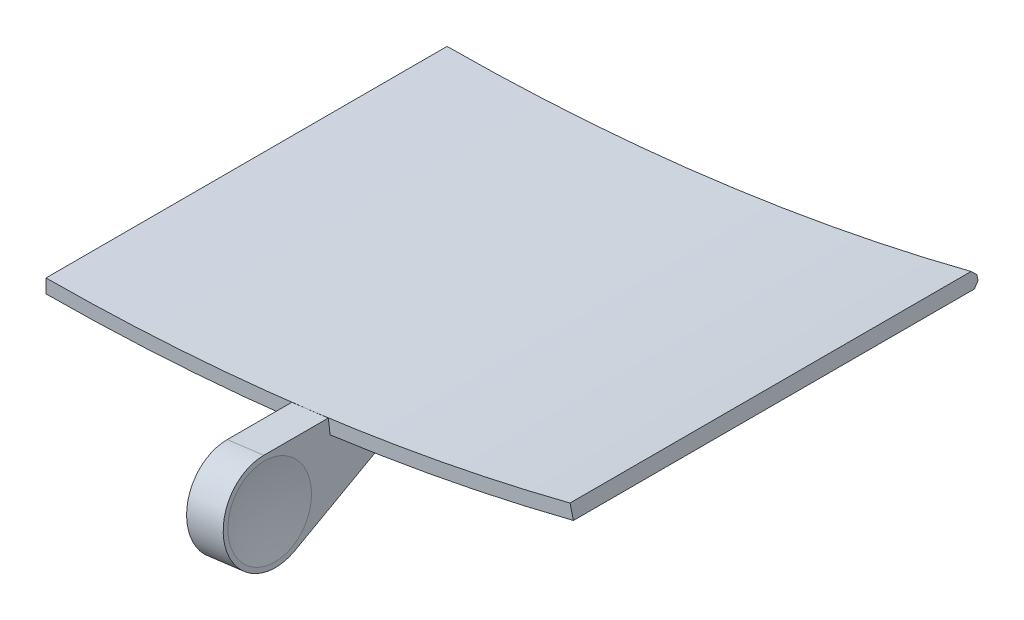
ISO-10303-21;
HEADER;
FILE_DESCRIPTION(('STEP AP214'),'2;1');
FILE_NAME('part.step','',(''),(''),'','','');
FILE_SCHEMA(('AUTOMOTIVE_DESIGN { 1 0 10303 214 1 1 1 1 }'));
ENDSEC;
DATA;
#1=APPLICATION_CONTEXT('core data for automotive mechanical design processes');
#2=APPLICATION_PROTOCOL_DEFINITION('international standard','automotive_design',2000,#1);
#3=PRODUCT_CONTEXT('',#1,'mechanical');
#4=PRODUCT('Part','Part','',(#3));
#5=PRODUCT_RELATED_PRODUCT_CATEGORY('part','',(#4));
#6=PRODUCT_DEFINITION_FORMATION('','',#4);
#7=PRODUCT_DEFINITION_CONTEXT('part definition',#1,'design');
#8=PRODUCT_DEFINITION('design','',#6,#7);
#9=PRODUCT_DEFINITION_SHAPE('','',#8);
#10=(LENGTH_UNIT() NAMED_UNIT(*) SI_UNIT(.MILLI.,.METRE.));
#11=(NAMED_UNIT(*) PLANE_ANGLE_UNIT() SI_UNIT($,.RADIAN.));
#12=(NAMED_UNIT(*) SI_UNIT($,.STERADIAN.) SOLID_ANGLE_UNIT());
#13=UNCERTAINTY_MEASURE_WITH_UNIT(LENGTH_MEASURE(1.E-05),#10,'distance_accuracy_value','');
#14=(GEOMETRIC_REPRESENTATION_CONTEXT(3) GLOBAL_UNCERTAINTY_ASSIGNED_CONTEXT((#13)) GLOBAL_UNIT_ASSIGNED_CONTEXT((#10,
#11,#12)) REPRESENTATION_CONTEXT('',''));
#15=CARTESIAN_POINT('',(0.,0.,0.));
#16=DIRECTION('',(0.,0.,1.));
#17=DIRECTION('',(1.,0.,0.));
#18=AXIS2_PLACEMENT_3D('',#15,#16,#17);
#19=CARTESIAN_POINT('',(0.,0.,44.));
#20=DIRECTION('',(0.,0.,-1.));
#21=DIRECTION('',(-1.,0.,0.));
#22=AXIS2_PLACEMENT_3D('',#19,#20,#21);
#23=CYLINDRICAL_SURFACE('',#22,236.500000000393);
#24=DIRECTION('',(0.,0.,-1.));
#25=VECTOR('',#24,1.);
#26=CARTESIAN_POINT('',(32.013045813414,-234.323312749573,44.));
#27=LINE('',#26,#25);
#28=CARTESIAN_POINT('',(32.013045813414,-234.323312749573,31.687942508641));
#29=VERTEX_POINT('',#28);
#30=CARTESIAN_POINT('',(32.013045813414,-234.323312749573,44.));
#31=VERTEX_POINT('',#30);
#32=EDGE_CURVE('E64',#29,#31,#27,.F.);
#33=ORIENTED_EDGE('',*,*,#32,.F.);
#34=CARTESIAN_POINT('',(0.,0.,-474.208939921087));
#35=DIRECTION('',(0.11502993686361,-0.898571297000495,-0.423482866043011));
#36=DIRECTION('',(-0.0537730281143868,0.42005499554155,-0.905904113120146));
#37=AXIS2_PLACEMENT_3D('',#34,#35,#36);
#38=ELLIPSE('',#37,558.464152777254,236.500000000393);
#39=CARTESIAN_POINT('',(28.0454237042457,-234.831224945567,31.687942508641));
#40=VERTEX_POINT('',#39);
#41=EDGE_CURVE('E11',#29,#40,#38,.T.);
#42=ORIENTED_EDGE('',*,*,#41,.T.);
#43=DIRECTION('',(0.,0.,-1.));
#44=VECTOR('',#43,1.);
#45=CARTESIAN_POINT('',(28.0454237042457,-234.831224945567,44.));
#46=LINE('',#45,#44);
#47=CARTESIAN_POINT('',(28.0454237042457,-234.831224945567,44.));
#48=VERTEX_POINT('',#47);
#49=EDGE_CURVE('E181',#40,#48,#46,.F.);
#50=ORIENTED_EDGE('',*,*,#49,.T.);
#51=CARTESIAN_POINT('',(0.,0.,44.));
#52=DIRECTION('',(0.,0.,1.));
#53=DIRECTION('',(1.,0.,0.));
#54=AXIS2_PLACEMENT_3D('',#51,#52,#53);
#55=CIRCLE('',#54,236.500000000393);
#56=CARTESIAN_POINT('',(1.2,-236.49695558363,44.));
#57=VERTEX_POINT('',#56);
#58=EDGE_CURVE('E303',#57,#48,#55,.T.);
#59=ORIENTED_EDGE('',*,*,#58,.F.);
#60=DIRECTION('',(0.,0.,1.));
#61=VECTOR('',#60,1.);
#62=CARTESIAN_POINT('',(1.2,-236.49695558363,0.));
#63=LINE('',#62,#61);
#64=CARTESIAN_POINT('',(1.2,-236.49695558363,0.500000000245665));
#65=VERTEX_POINT('',#64);
#66=EDGE_CURVE('E197',#65,#57,#63,.T.);
#67=ORIENTED_EDGE('',*,*,#66,.F.);
#68=CARTESIAN_POINT('',(0.,0.,0.499999999999973));
#69=DIRECTION('',(0.,0.,1.));
#70=DIRECTION('',(1.,0.,0.));
#71=AXIS2_PLACEMENT_3D('',#68,#69,#70);
#72=CIRCLE('',#71,236.500000000393);
#73=CARTESIAN_POINT('',(58.4123874795451,-229.172954314259,0.499999999999973));
#74=VERTEX_POINT('',#73);
#75=EDGE_CURVE('E297',#65,#74,#72,.T.);
#76=ORIENTED_EDGE('',*,*,#75,.T.);
#77=DIRECTION('',(0.,0.,1.));
#78=VECTOR('',#77,1.);
#79=CARTESIAN_POINT('',(58.4123874796194,-229.172954314544,0.));
#80=LINE('',#79,#78);
#81=CARTESIAN_POINT('',(58.4123874796194,-229.172954314544,44.));
#82=VERTEX_POINT('',#81);
#83=EDGE_CURVE('E192',#74,#82,#80,.T.);
#84=ORIENTED_EDGE('',*,*,#83,.T.);
#85=EDGE_CURVE('E307',#31,#82,#55,.T.);
#86=ORIENTED_EDGE('',*,*,#85,.F.);
#87=EDGE_LOOP('',(#33,#42,#50,#59,#67,#76,#84,#86));
#88=FACE_BOUND('',#87,.T.);
#89=ADVANCED_FACE('F47',(#88),#23,.T.);
#90=CARTESIAN_POINT('',(0.,0.,44.));
#91=DIRECTION('',(0.,0.,1.));
#92=DIRECTION('',(1.,0.,0.));
#93=AXIS2_PLACEMENT_3D('',#90,#91,#92);
#94=PLANE('',#93);
#95=DIRECTION('',(-0.991905527292072,-0.126978048998387,0.));
#96=VECTOR('',#95,1.);
#97=CARTESIAN_POINT('',(31.8236525692553,-232.843842816033,44.));
#98=LINE('',#97,#96);
#99=CARTESIAN_POINT('',(31.8236525692553,-232.843842816033,44.));
#100=VERTEX_POINT('',#99);
#101=CARTESIAN_POINT('',(29.8398415146712,-233.097798914029,44.));
#102=VERTEX_POINT('',#101);
#103=EDGE_CURVE('E177',#100,#102,#98,.T.);
#104=ORIENTED_EDGE('',*,*,#103,.F.);
#105=DIRECTION('',(0.126978048998387,-0.991905527292072,0.));
#106=VECTOR('',#105,1.);
#107=CARTESIAN_POINT('',(1.98381105458415,0.253956097996774,44.));
#108=LINE('',#107,#106);
#109=EDGE_CURVE('E58',#100,#31,#108,.T.);
#110=ORIENTED_EDGE('',*,*,#109,.T.);
#111=ORIENTED_EDGE('',*,*,#85,.T.);
#112=DIRECTION('',(0.251900457292544,-0.967753150145122,0.));
#113=VECTOR('',#112,1.);
#114=CARTESIAN_POINT('',(58.0345318984014,-227.721305782605,44.));
#115=LINE('',#114,#113);
#116=CARTESIAN_POINT('',(58.0345318984014,-227.721305782605,44.));
#117=VERTEX_POINT('',#116);
#118=EDGE_CURVE('E202',#117,#82,#115,.T.);
#119=ORIENTED_EDGE('',*,*,#118,.F.);
#120=CARTESIAN_POINT('',(0.,0.,44.));
#121=DIRECTION('',(0.,0.,-1.));
#122=DIRECTION('',(1.,0.,0.));
#123=AXIS2_PLACEMENT_3D('',#120,#121,#122);
#124=CIRCLE('',#123,235.000000000396);
#125=EDGE_CURVE('E308',#117,#102,#124,.T.);
#126=ORIENTED_EDGE('',*,*,#125,.T.);
#127=EDGE_LOOP('',(#104,#110,#111,#119,#126));
#128=FACE_BOUND('',#127,.T.);
#129=ADVANCED_FACE('F277',(#128),#94,.T.);
#130=CARTESIAN_POINT('',(0.,0.,44.));
#131=DIRECTION('',(0.,0.,-1.));
#132=DIRECTION('',(-1.,0.,0.));
#133=AXIS2_PLACEMENT_3D('',#130,#131,#132);
#134=CYLINDRICAL_SURFACE('',#133,235.000000000396);
#135=CARTESIAN_POINT('',(0.,0.,0.499999999999973));
#136=DIRECTION('',(0.,0.,1.));
#137=DIRECTION('',(1.,0.,0.));
#138=AXIS2_PLACEMENT_3D('',#135,#136,#137);
#139=CIRCLE('',#138,235.000000000396);
#140=CARTESIAN_POINT('',(58.0345318984014,-227.721305782605,0.500000000393128));
#141=VERTEX_POINT('',#140);
#142=CARTESIAN_POINT('',(1.2,-234.996936150243,0.500000000393142));
#143=VERTEX_POINT('',#142);
#144=EDGE_CURVE('E259',#141,#143,#139,.F.);
#145=ORIENTED_EDGE('',*,*,#144,.T.);
#146=DIRECTION('',(0.,0.,1.));
#147=VECTOR('',#146,1.);
#148=CARTESIAN_POINT('',(1.2,-234.996936150243,0.));
#149=LINE('',#148,#147);
#150=CARTESIAN_POINT('',(1.2,-234.996936150243,44.));
#151=VERTEX_POINT('',#150);
#152=EDGE_CURVE('E203',#143,#151,#149,.T.);
#153=ORIENTED_EDGE('',*,*,#152,.T.);
#154=EDGE_CURVE('E311',#102,#151,#124,.T.);
#155=ORIENTED_EDGE('',*,*,#154,.F.);
#156=ORIENTED_EDGE('',*,*,#125,.F.);
#157=DIRECTION('',(0.,0.,1.));
#158=VECTOR('',#157,1.);
#159=CARTESIAN_POINT('',(58.0345318984014,-227.721305782605,0.));
#160=LINE('',#159,#158);
#161=EDGE_CURVE('E210',#141,#117,#160,.T.);
#162=ORIENTED_EDGE('',*,*,#161,.F.);
#163=EDGE_LOOP('',(#145,#153,#155,#156,#162));
#164=FACE_BOUND('',#163,.T.);
#165=ADVANCED_FACE('F273',(#164),#134,.F.);
#166=DIRECTION('',(-0.991905527292072,-0.126978048998387,0.));
#167=VECTOR('',#166,1.);
#168=CARTESIAN_POINT('',(29.8398415146712,-233.097798914029,44.));
#169=LINE('',#168,#167);
#170=CARTESIAN_POINT('',(27.8560304600871,-233.351755012026,44.));
#171=VERTEX_POINT('',#170);
#172=EDGE_CURVE('E333',#102,#171,#169,.T.);
#173=ORIENTED_EDGE('',*,*,#172,.F.);
#174=ORIENTED_EDGE('',*,*,#154,.T.);
#175=DIRECTION('',(0.,1.,0.));
#176=VECTOR('',#175,1.);
#177=CARTESIAN_POINT('',(1.2,-234.996936150243,44.));
#178=LINE('',#177,#176);
#179=EDGE_CURVE('E198',#57,#151,#178,.T.);
#180=ORIENTED_EDGE('',*,*,#179,.F.);
#181=ORIENTED_EDGE('',*,*,#58,.T.);
#182=DIRECTION('',(0.126978048998387,-0.991905527292072,0.));
#183=VECTOR('',#182,1.);
#184=CARTESIAN_POINT('',(-1.98381105458415,-0.253956097996774,44.));
#185=LINE('',#184,#183);
#186=EDGE_CURVE('E330',#171,#48,#185,.T.);
#187=ORIENTED_EDGE('',*,*,#186,.F.);
#188=EDGE_LOOP('',(#173,#174,#180,#181,#187));
#189=FACE_BOUND('',#188,.T.);
#190=ADVANCED_FACE('F246',(#189),#94,.T.);
#191=CARTESIAN_POINT('',(0.,0.,0.));
#192=DIRECTION('',(0.,0.,1.));
#193=DIRECTION('',(1.,0.,0.));
#194=AXIS2_PLACEMENT_3D('',#191,#192,#193);
#195=PLANE('',#194);
#196=CARTESIAN_POINT('',(0.,0.,0.));
#197=DIRECTION('',(0.,0.,1.));
#198=DIRECTION('',(1.,0.,0.));
#199=AXIS2_PLACEMENT_3D('',#196,#197,#198);
#200=CIRCLE('',#199,236.000000000393);
#201=CARTESIAN_POINT('',(58.2864356261108,-228.689071497063,0.));
#202=VERTEX_POINT('',#201);
#203=CARTESIAN_POINT('',(1.2,-235.996949133216,0.));
#204=VERTEX_POINT('',#203);
#205=EDGE_CURVE('E291',#202,#204,#200,.F.);
#206=ORIENTED_EDGE('',*,*,#205,.T.);
#207=DIRECTION('',(0.,1.,0.));
#208=VECTOR('',#207,1.);
#209=CARTESIAN_POINT('',(1.2,-234.996936150243,0.));
#210=LINE('',#209,#208);
#211=CARTESIAN_POINT('',(1.2,-235.496942655709,0.));
#212=VERTEX_POINT('',#211);
#213=EDGE_CURVE('E193',#204,#212,#210,.T.);
#214=ORIENTED_EDGE('',*,*,#213,.T.);
#215=CARTESIAN_POINT('',(0.,0.,0.));
#216=DIRECTION('',(0.,0.,1.));
#217=DIRECTION('',(1.,0.,0.));
#218=AXIS2_PLACEMENT_3D('',#215,#216,#217);
#219=CIRCLE('',#218,235.500000000396);
#220=CARTESIAN_POINT('',(58.1604837657777,-228.205188653363,0.));
#221=VERTEX_POINT('',#220);
#222=EDGE_CURVE('E298',#212,#221,#219,.T.);
#223=ORIENTED_EDGE('',*,*,#222,.T.);
#224=DIRECTION('',(0.251900457292544,-0.967753150145122,0.));
#225=VECTOR('',#224,1.);
#226=CARTESIAN_POINT('',(58.0345318984014,-227.721305782605,0.));
#227=LINE('',#226,#225);
#228=EDGE_CURVE('E213',#221,#202,#227,.T.);
#229=ORIENTED_EDGE('',*,*,#228,.T.);
#230=EDGE_LOOP('',(#206,#214,#223,#229));
#231=FACE_BOUND('',#230,.T.);
#232=ADVANCED_FACE('F280',(#231),#195,.F.);
#233=CARTESIAN_POINT('',(0.,0.,0.499999999999973));
#234=DIRECTION('',(0.,0.,-1.));
#235=DIRECTION('',(-1.,0.,0.));
#236=AXIS2_PLACEMENT_3D('',#233,#234,#235);
#237=CONICAL_SURFACE('',#236,235.000000000396,0.785398163397504);
#238=CARTESIAN_POINT('',(1.2,-234.287826686805,1.20910019072185));
#239=CARTESIAN_POINT('',(1.2,-234.607530926746,0.88940014410588));
#240=CARTESIAN_POINT('',(1.2,-234.927235158208,0.56970008901092));
#241=CARTESIAN_POINT('',(1.2,-235.566643604175,-0.0697000381369862));
#242=CARTESIAN_POINT('',(1.2,-235.886347818679,-0.389400110189931));
#243=CARTESIAN_POINT('',(1.2,-236.206052024705,-0.709100190721872));
#244=B_SPLINE_CURVE_WITH_KNOTS('',3,(#238,#239,#240,#241,#242,#243),.UNSPECIFIED.,.F.,.F.,(4,2,
4),(0.,1.35638132086163,2.71276264172324),.UNSPECIFIED.);
#245=EDGE_CURVE('E230',#143,#212,#244,.T.);
#246=ORIENTED_EDGE('',*,*,#245,.F.);
#247=ORIENTED_EDGE('',*,*,#144,.F.);
#248=CARTESIAN_POINT('',(58.1605341465232,-228.205382206506,-0.000200000000002847));
#249=CARTESIAN_POINT('',(58.1395250956562,-228.124669470306,0.0832011114824541));
#250=CARTESIAN_POINT('',(58.1185160446438,-228.043956733548,0.166602222387889));
#251=CARTESIAN_POINT('',(58.0764979423284,-227.882531258914,0.33340444304471));
#252=CARTESIAN_POINT('',(58.0554888910253,-227.801818521039,0.416805552796095));
#253=CARTESIAN_POINT('',(58.0344798395769,-227.721105782605,0.500206661970459));
#254=B_SPLINE_CURVE_WITH_KNOTS('',3,(#248,#249,#250,#251,#252,#253),.UNSPECIFIED.,.F.,.F.,(4,2,
4),(0.,0.353843245799129,0.70768649159824),.UNSPECIFIED.);
#255=EDGE_CURVE('E207',#221,#141,#254,.T.);
#256=ORIENTED_EDGE('',*,*,#255,.F.);
#257=ORIENTED_EDGE('',*,*,#222,.F.);
#258=EDGE_LOOP('',(#246,#247,#256,#257));
#259=FACE_BOUND('',#258,.T.);
#260=ADVANCED_FACE('F50',(#259),#237,.F.);
#261=CARTESIAN_POINT('',(0.,0.,0.499999999999973));
#262=DIRECTION('',(0.,0.,1.));
#263=DIRECTION('',(1.,0.,0.));
#264=AXIS2_PLACEMENT_3D('',#261,#262,#263);
#265=CONICAL_SURFACE('',#264,236.500000000393,0.785398163397504);
#266=CARTESIAN_POINT('',(1.2,-234.415571285973,-1.58135726622618));
#267=CARTESIAN_POINT('',(1.2,-235.026028274335,-0.970908275365239));
#268=CARTESIAN_POINT('',(1.2,-235.636485232173,-0.360459253979692));
#269=CARTESIAN_POINT('',(1.2,-236.857399086801,0.860438849840613));
#270=CARTESIAN_POINT('',(1.2,-237.467855983591,1.47088793227537));
#271=CARTESIAN_POINT('',(1.2,-238.078312849856,2.08133704523474));
#272=B_SPLINE_CURVE_WITH_KNOTS('',3,(#266,#267,#268,#269,#270,#271),.UNSPECIFIED.,.F.,.F.,(4,2,
4),(0.,2.58993269135552,5.17986538271101),.UNSPECIFIED.);
#273=EDGE_CURVE('E258',#204,#65,#272,.T.);
#274=ORIENTED_EDGE('',*,*,#273,.F.);
#275=ORIENTED_EDGE('',*,*,#205,.F.);
#276=CARTESIAN_POINT('',(58.412439538444,-229.173154314544,0.500206661906255));
#277=CARTESIAN_POINT('',(58.391430489885,-229.092441587212,0.416805550449092));
#278=CARTESIAN_POINT('',(58.3704214411825,-229.011728859327,0.333404439561655));
#279=CARTESIAN_POINT('',(58.3284033434906,-228.850303402456,0.166602218926238));
#280=CARTESIAN_POINT('',(58.3073942945011,-228.769590673469,0.0832011091782576));
#281=CARTESIAN_POINT('',(58.2863852453681,-228.688877943931,-0.000199999999995549));
#282=B_SPLINE_CURVE_WITH_KNOTS('',3,(#276,#277,#278,#279,#280,#281),.UNSPECIFIED.,.F.,.F.,(4,2,
4),(0.,0.353843226308513,0.707686452617012),.UNSPECIFIED.);
#283=EDGE_CURVE('E250',#74,#202,#282,.T.);
#284=ORIENTED_EDGE('',*,*,#283,.F.);
#285=ORIENTED_EDGE('',*,*,#75,.F.);
#286=EDGE_LOOP('',(#274,#275,#284,#285));
#287=FACE_BOUND('',#286,.T.);
#288=ADVANCED_FACE('F242',(#287),#265,.T.);
#289=CARTESIAN_POINT('',(58.0345318984014,-227.721305782605,0.));
#290=DIRECTION('',(-0.967753150145122,-0.251900457292544,0.));
#291=DIRECTION('',(0.251900457292544,-0.967753150145122,0.));
#292=AXIS2_PLACEMENT_3D('',#289,#290,#291);
#293=PLANE('',#292);
#294=ORIENTED_EDGE('',*,*,#255,.T.);
#295=ORIENTED_EDGE('',*,*,#161,.T.);
#296=ORIENTED_EDGE('',*,*,#118,.T.);
#297=ORIENTED_EDGE('',*,*,#83,.F.);
#298=ORIENTED_EDGE('',*,*,#283,.T.);
#299=ORIENTED_EDGE('',*,*,#228,.F.);
#300=EDGE_LOOP('',(#294,#295,#296,#297,#298,#299));
#301=FACE_BOUND('',#300,.T.);
#302=ADVANCED_FACE('F237',(#301),#293,.F.);
#303=CARTESIAN_POINT('',(1.2,-234.996936150243,0.));
#304=DIRECTION('',(1.,0.,0.));
#305=DIRECTION('',(0.,1.,0.));
#306=AXIS2_PLACEMENT_3D('',#303,#304,#305);
#307=PLANE('',#306);
#308=ORIENTED_EDGE('',*,*,#245,.T.);
#309=ORIENTED_EDGE('',*,*,#213,.F.);
#310=ORIENTED_EDGE('',*,*,#273,.T.);
#311=ORIENTED_EDGE('',*,*,#66,.T.);
#312=ORIENTED_EDGE('',*,*,#179,.T.);
#313=ORIENTED_EDGE('',*,*,#152,.F.);
#314=EDGE_LOOP('',(#308,#309,#310,#311,#312,#313));
#315=FACE_BOUND('',#314,.T.);
#316=ADVANCED_FACE('F241',(#315),#307,.F.);
#317=CARTESIAN_POINT('',(32.4585428142473,-237.803370452493,51.));
#318=DIRECTION('',(-0.991905527292072,-0.126978048998387,0.));
#319=DIRECTION('',(0.126978048998387,-0.991905527292072,0.));
#320=AXIS2_PLACEMENT_3D('',#317,#318,#319);
#321=PLANE('',#320);
#322=CARTESIAN_POINT('',(32.4585428142473,-237.803370452493,51.));
#323=DIRECTION('',(0.991905527292072,0.126978048998387,0.));
#324=DIRECTION('',(-0.126978048998387,0.991905527292072,0.));
#325=AXIS2_PLACEMENT_3D('',#322,#323,#324);
#326=CIRCLE('',#325,4.5);
#327=CARTESIAN_POINT('',(31.8871415937545,-233.339795579679,51.));
#328=VERTEX_POINT('',#327);
#329=EDGE_CURVE('E145',#328,#328,#326,.T.);
#330=ORIENTED_EDGE('',*,*,#329,.F.);
#331=EDGE_LOOP('',(#330));
#332=FACE_BOUND('',#331,.T.);
#333=DIRECTION('',(0.0537730281143868,-0.42005499554155,0.905904113120146));
#334=VECTOR('',#333,1.);
#335=CARTESIAN_POINT('',(31.8534938188997,-233.076951614735,29.));
#336=LINE('',#335,#334);
#337=CARTESIAN_POINT('',(33.0336924985653,-242.296226937495,48.8825856697849));
#338=VERTEX_POINT('',#337);
#339=EDGE_CURVE('E165',#29,#338,#336,.T.);
#340=ORIENTED_EDGE('',*,*,#339,.F.);
#341=ORIENTED_EDGE('',*,*,#32,.T.);
#342=ORIENTED_EDGE('',*,*,#109,.F.);
#343=DIRECTION('',(0.,0.,-1.));
#344=VECTOR('',#343,1.);
#345=CARTESIAN_POINT('',(31.8236525692553,-232.843842816033,44.));
#346=LINE('',#345,#344);
#347=CARTESIAN_POINT('',(31.8236525692553,-232.843842816033,51.));
#348=VERTEX_POINT('',#347);
#349=EDGE_CURVE('E172',#348,#100,#346,.T.);
#350=ORIENTED_EDGE('',*,*,#349,.F.);
#351=CARTESIAN_POINT('',(32.4585428142473,-237.803370452493,51.));
#352=DIRECTION('',(-0.991905527292072,-0.126978048998387,0.));
#353=DIRECTION('',(0.126978048998387,-0.991905527292072,0.));
#354=AXIS2_PLACEMENT_3D('',#351,#352,#353);
#355=CIRCLE('',#354,4.99999999999999);
#356=EDGE_CURVE('E168',#338,#348,#355,.T.);
#357=ORIENTED_EDGE('',*,*,#356,.F.);
#358=EDGE_LOOP('',(#340,#341,#342,#350,#357));
#359=FACE_BOUND('',#358,.T.);
#360=ADVANCED_FACE('F340',(#332,#359),#321,.F.);
#361=CARTESIAN_POINT('',(28.490920705079,-238.311282648487,51.));
#362=DIRECTION('',(-0.991905527292072,-0.126978048998387,0.));
#363=DIRECTION('',(0.126978048998387,-0.991905527292072,0.));
#364=AXIS2_PLACEMENT_3D('',#361,#362,#363);
#365=PLANE('',#364);
#366=CARTESIAN_POINT('',(28.490920705079,-238.311282648487,51.));
#367=DIRECTION('',(0.991905527292072,0.126978048998387,0.));
#368=DIRECTION('',(-0.126978048998387,0.991905527292072,0.));
#369=AXIS2_PLACEMENT_3D('',#366,#367,#368);
#370=CIRCLE('',#369,4.5);
#371=CARTESIAN_POINT('',(27.9195194845863,-233.847707775672,51.));
#372=VERTEX_POINT('',#371);
#373=EDGE_CURVE('E149',#372,#372,#370,.T.);
#374=ORIENTED_EDGE('',*,*,#373,.T.);
#375=EDGE_LOOP('',(#374));
#376=FACE_BOUND('',#375,.T.);
#377=ORIENTED_EDGE('',*,*,#49,.F.);
#378=DIRECTION('',(0.0537730281143868,-0.42005499554155,0.905904113120146));
#379=VECTOR('',#378,1.);
#380=CARTESIAN_POINT('',(27.8858717097314,-233.584863810728,29.));
#381=LINE('',#380,#379);
#382=CARTESIAN_POINT('',(29.066070389397,-242.804139133489,48.8825856697849));
#383=VERTEX_POINT('',#382);
#384=EDGE_CURVE('E148',#40,#383,#381,.T.);
#385=ORIENTED_EDGE('',*,*,#384,.T.);
#386=CARTESIAN_POINT('',(28.490920705079,-238.311282648487,51.));
#387=DIRECTION('',(-0.991905527292072,-0.126978048998387,0.));
#388=DIRECTION('',(0.126978048998387,-0.991905527292072,0.));
#389=AXIS2_PLACEMENT_3D('',#386,#387,#388);
#390=CIRCLE('',#389,4.99999999999999);
#391=CARTESIAN_POINT('',(27.8560304600871,-233.351755012026,51.));
#392=VERTEX_POINT('',#391);
#393=EDGE_CURVE('E153',#383,#392,#390,.T.);
#394=ORIENTED_EDGE('',*,*,#393,.T.);
#395=DIRECTION('',(0.,0.,-1.));
#396=VECTOR('',#395,1.);
#397=CARTESIAN_POINT('',(27.8560304600871,-233.351755012026,44.));
#398=LINE('',#397,#396);
#399=EDGE_CURVE('E161',#392,#171,#398,.T.);
#400=ORIENTED_EDGE('',*,*,#399,.T.);
#401=ORIENTED_EDGE('',*,*,#186,.T.);
#402=EDGE_LOOP('',(#377,#385,#394,#400,#401));
#403=FACE_BOUND('',#402,.T.);
#404=ADVANCED_FACE('F351',(#376,#403),#365,.T.);
#405=CARTESIAN_POINT('',(31.8236525692553,-232.843842816033,44.));
#406=DIRECTION('',(-0.126978048998387,0.991905527292072,0.));
#407=DIRECTION('',(-0.991905527292072,-0.126978048998387,0.));
#408=AXIS2_PLACEMENT_3D('',#405,#406,#407);
#409=PLANE('',#408);
#410=ORIENTED_EDGE('',*,*,#103,.T.);
#411=ORIENTED_EDGE('',*,*,#172,.T.);
#412=ORIENTED_EDGE('',*,*,#399,.F.);
#413=DIRECTION('',(-0.991905527292072,-0.126978048998387,0.));
#414=VECTOR('',#413,1.);
#415=CARTESIAN_POINT('',(31.8236525692553,-232.843842816033,51.));
#416=LINE('',#415,#414);
#417=EDGE_CURVE('E182',#348,#392,#416,.T.);
#418=ORIENTED_EDGE('',*,*,#417,.F.);
#419=ORIENTED_EDGE('',*,*,#349,.T.);
#420=EDGE_LOOP('',(#410,#411,#412,#418,#419));
#421=FACE_BOUND('',#420,.T.);
#422=ADVANCED_FACE('F353',(#421),#409,.T.);
#423=CARTESIAN_POINT('',(32.4585428142473,-237.803370452493,51.));
#424=DIRECTION('',(-0.991905527292072,-0.126978048998387,0.));
#425=DIRECTION('',(0.126978048998387,-0.991905527292072,0.));
#426=AXIS2_PLACEMENT_3D('',#423,#424,#425);
#427=CYLINDRICAL_SURFACE('',#426,4.99999999999999);
#428=ORIENTED_EDGE('',*,*,#417,.T.);
#429=ORIENTED_EDGE('',*,*,#393,.F.);
#430=DIRECTION('',(-0.991905527292072,-0.126978048998387,0.));
#431=VECTOR('',#430,1.);
#432=CARTESIAN_POINT('',(33.0336924985653,-242.296226937495,48.8825856697849));
#433=LINE('',#432,#431);
#434=EDGE_CURVE('E176',#338,#383,#433,.T.);
#435=ORIENTED_EDGE('',*,*,#434,.F.);
#436=ORIENTED_EDGE('',*,*,#356,.T.);
#437=EDGE_LOOP('',(#428,#429,#435,#436));
#438=FACE_BOUND('',#437,.T.);
#439=ADVANCED_FACE('F348',(#438),#427,.T.);
#440=CARTESIAN_POINT('',(31.8534938188997,-233.076951614735,29.));
#441=DIRECTION('',(0.11502993686361,-0.898571297000495,-0.423482866043011));
#442=DIRECTION('',(0.,0.426312719018111,-0.904575848452403));
#443=AXIS2_PLACEMENT_3D('',#440,#441,#442);
#444=PLANE('',#443);
#445=ORIENTED_EDGE('',*,*,#41,.F.);
#446=ORIENTED_EDGE('',*,*,#339,.T.);
#447=ORIENTED_EDGE('',*,*,#434,.T.);
#448=ORIENTED_EDGE('',*,*,#384,.F.);
#449=EDGE_LOOP('',(#445,#446,#447,#448));
#450=FACE_BOUND('',#449,.T.);
#451=ADVANCED_FACE('F344',(#450),#444,.T.);
#452=CARTESIAN_POINT('',(9.29923170434508,-241.147357286505,51.));
#453=DIRECTION('',(0.,0.,-1.));
#454=DIRECTION('',(-0.126978048998387,0.991905527292072,0.));
#455=AXIS2_PLACEMENT_3D('',#452,#453,#454);
#456=CIRCLE('',#455,20.);
#457=TRIMMED_CURVE('',#456,(PARAMETER_VALUE(-1.55198547330173)),
(PARAMETER_VALUE(1.55198547330173)),.T.,.PARAMETER.);
#458=CARTESIAN_POINT('',(9.25146321206283,-240.774207502752,51.));
#459=DIRECTION('',(0.991905527292072,0.126978048998387,0.));
#460=AXIS1_PLACEMENT('',#458,#459);
#461=SURFACE_OF_REVOLUTION('',#457,#460);
#462=ORIENTED_EDGE('',*,*,#373,.F.);
#463=EDGE_LOOP('',(#462));
#464=FACE_BOUND('',#463,.T.);
#465=CARTESIAN_POINT('',(29.0860640214542,-238.235095819087,51.));
#466=VERTEX_POINT('',#465);
#467=VERTEX_LOOP('',#466);
#468=FACE_BOUND('',#467,.T.);
#469=ADVANCED_FACE('F141',(#464,#468),#461,.F.);
#470=CARTESIAN_POINT('',(51.7457687995457,-235.713595381981,51.));
#471=DIRECTION('',(0.,0.,-1.));
#472=DIRECTION('',(-0.126978048998387,0.991905527292072,0.));
#473=AXIS2_PLACEMENT_3D('',#470,#471,#472);
#474=CIRCLE('',#473,20.);
#475=TRIMMED_CURVE('',#474,(PARAMETER_VALUE(-1.55198547330173)),
(PARAMETER_VALUE(1.55198547330173)),.T.,.PARAMETER.);
#476=CARTESIAN_POINT('',(51.6980003072634,-235.340445598228,51.));
#477=DIRECTION('',(0.991905527292072,0.126978048998387,0.));
#478=AXIS1_PLACEMENT('',#476,#477);
#479=SURFACE_OF_REVOLUTION('',#475,#478);
#480=CARTESIAN_POINT('',(31.863399497872,-237.879557281892,51.));
#481=VERTEX_POINT('',#480);
#482=VERTEX_LOOP('',#481);
#483=FACE_BOUND('',#482,.T.);
#484=ORIENTED_EDGE('',*,*,#329,.T.);
#485=EDGE_LOOP('',(#484));
#486=FACE_BOUND('',#485,.T.);
#487=ADVANCED_FACE('F138',(#483,#486),#479,.F.);
#488=CLOSED_SHELL('',(#89,#129,#165,#190,#232,#260,#288,#302,#316,#360,#404,#422,#439,#451,#469,#487));
#489=MANIFOLD_SOLID_BREP('B2',#488);
#490=ADVANCED_BREP_SHAPE_REPRESENTATION('',(#18,#489),#14);
#491=SHAPE_DEFINITION_REPRESENTATION(#9,#490);
ENDSEC;
END-ISO-10303-21;
